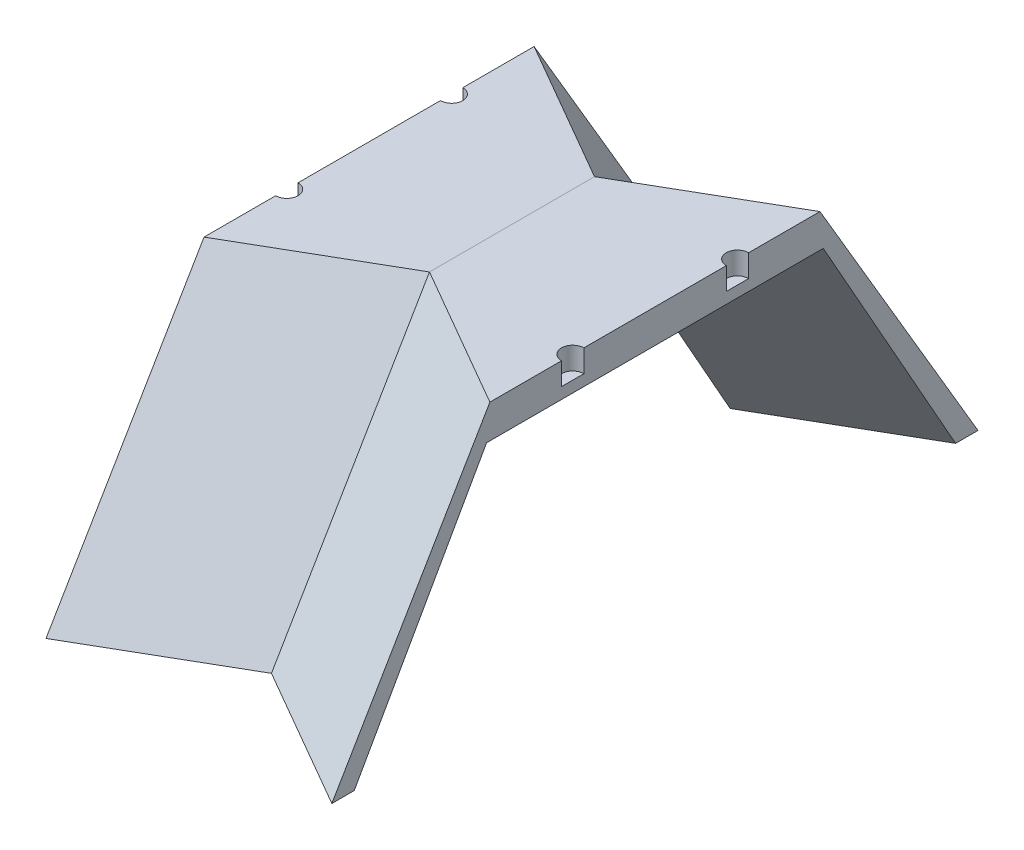
ISO-10303-21;
HEADER;
FILE_DESCRIPTION(('STEP AP214'),'2;1');
FILE_NAME('part.step','',(''),(''),'','','');
FILE_SCHEMA(('AUTOMOTIVE_DESIGN { 1 0 10303 214 1 1 1 1 }'));
ENDSEC;
DATA;
#1=APPLICATION_CONTEXT('core data for automotive mechanical design processes');
#2=APPLICATION_PROTOCOL_DEFINITION('international standard','automotive_design',2000,#1);
#3=PRODUCT_CONTEXT('',#1,'mechanical');
#4=PRODUCT('Part','Part','',(#3));
#5=PRODUCT_RELATED_PRODUCT_CATEGORY('part','',(#4));
#6=PRODUCT_DEFINITION_FORMATION('','',#4);
#7=PRODUCT_DEFINITION_CONTEXT('part definition',#1,'design');
#8=PRODUCT_DEFINITION('design','',#6,#7);
#9=PRODUCT_DEFINITION_SHAPE('','',#8);
#10=(LENGTH_UNIT() NAMED_UNIT(*) SI_UNIT(.MILLI.,.METRE.));
#11=(NAMED_UNIT(*) PLANE_ANGLE_UNIT() SI_UNIT($,.RADIAN.));
#12=(NAMED_UNIT(*) SI_UNIT($,.STERADIAN.) SOLID_ANGLE_UNIT());
#13=UNCERTAINTY_MEASURE_WITH_UNIT(LENGTH_MEASURE(1.E-05),#10,'distance_accuracy_value','');
#14=(GEOMETRIC_REPRESENTATION_CONTEXT(3) GLOBAL_UNCERTAINTY_ASSIGNED_CONTEXT((#13)) GLOBAL_UNIT_ASSIGNED_CONTEXT((#10,
#11,#12)) REPRESENTATION_CONTEXT('',''));
#15=CARTESIAN_POINT('',(0.,0.,0.));
#16=DIRECTION('',(0.,0.,1.));
#17=DIRECTION('',(1.,0.,0.));
#18=AXIS2_PLACEMENT_3D('',#15,#16,#17);
#19=CARTESIAN_POINT('',(-127.713892121337,0.,0.));
#20=DIRECTION('',(0.,1.,0.));
#21=DIRECTION('',(0.,0.,1.));
#22=AXIS2_PLACEMENT_3D('',#19,#20,#21);
#23=PLANE('',#22);
#24=DIRECTION('',(-0.866025403784439,0.,0.5));
#25=VECTOR('',#24,1.);
#26=CARTESIAN_POINT('',(-2.71389212133705,0.,72.1687836487032));
#27=LINE('',#26,#25);
#28=CARTESIAN_POINT('',(-63.8569460606685,0.,107.469742299652));
#29=VERTEX_POINT('',#28);
#30=CARTESIAN_POINT('',(-127.713892121337,0.,144.337567297407));
#31=VERTEX_POINT('',#30);
#32=EDGE_CURVE('E158',#29,#31,#27,.T.);
#33=ORIENTED_EDGE('',*,*,#32,.T.);
#34=DIRECTION('',(0.,0.,-1.));
#35=VECTOR('',#34,1.);
#36=CARTESIAN_POINT('',(-127.713892121337,0.,0.));
#37=LINE('',#36,#35);
#38=CARTESIAN_POINT('',(-127.713892121337,0.,134.337567297406));
#39=VERTEX_POINT('',#38);
#40=EDGE_CURVE('E229',#31,#39,#37,.T.);
#41=ORIENTED_EDGE('',*,*,#40,.T.);
#42=DIRECTION('',(0.866025403784439,0.,-0.5));
#43=VECTOR('',#42,1.);
#44=CARTESIAN_POINT('',(-127.713892121337,0.,134.337567297406));
#45=LINE('',#44,#43);
#46=CARTESIAN_POINT('',(-63.8569460606685,0.,97.469742299652));
#47=VERTEX_POINT('',#46);
#48=EDGE_CURVE('E159',#39,#47,#45,.T.);
#49=ORIENTED_EDGE('',*,*,#48,.T.);
#50=DIRECTION('',(0.,0.,-1.));
#51=VECTOR('',#50,1.);
#52=CARTESIAN_POINT('',(-63.8569460606685,0.,112.38082286301));
#53=LINE('',#52,#51);
#54=EDGE_CURVE('E144',#29,#47,#53,.T.);
#55=ORIENTED_EDGE('',*,*,#54,.F.);
#56=EDGE_LOOP('',(#33,#41,#49,#55));
#57=FACE_BOUND('',#56,.T.);
#58=ADVANCED_FACE('F54',(#57),#23,.F.);
#59=DIRECTION('',(-0.866025403784439,0.,-0.5));
#60=VECTOR('',#59,1.);
#61=CARTESIAN_POINT('',(-11.3741461591814,0.,-67.1687836487033));
#62=LINE('',#61,#60);
#63=CARTESIAN_POINT('',(-63.8569460606685,0.,-97.4697422996521));
#64=VERTEX_POINT('',#63);
#65=CARTESIAN_POINT('',(-127.713892121337,0.,-134.337567297406));
#66=VERTEX_POINT('',#65);
#67=EDGE_CURVE('E188',#64,#66,#62,.T.);
#68=ORIENTED_EDGE('',*,*,#67,.T.);
#69=CARTESIAN_POINT('',(-127.713892121337,0.,-144.337567297406));
#70=VERTEX_POINT('',#69);
#71=EDGE_CURVE('E223',#66,#70,#37,.T.);
#72=ORIENTED_EDGE('',*,*,#71,.T.);
#73=DIRECTION('',(0.866025403784439,0.,0.5));
#74=VECTOR('',#73,1.);
#75=CARTESIAN_POINT('',(-127.713892121337,0.,-144.337567297406));
#76=LINE('',#75,#74);
#77=CARTESIAN_POINT('',(-63.8569460606685,0.,-107.469742299652));
#78=VERTEX_POINT('',#77);
#79=EDGE_CURVE('E166',#70,#78,#76,.T.);
#80=ORIENTED_EDGE('',*,*,#79,.T.);
#81=EDGE_CURVE('E161',#64,#78,#53,.T.);
#82=ORIENTED_EDGE('',*,*,#81,.F.);
#83=EDGE_LOOP('',(#68,#72,#80,#82));
#84=FACE_BOUND('',#83,.T.);
#85=ADVANCED_FACE('F251',(#84),#23,.F.);
#86=CARTESIAN_POINT('',(-127.713892121337,120.,0.));
#87=DIRECTION('',(0.,1.,0.));
#88=DIRECTION('',(0.,0.,1.));
#89=AXIS2_PLACEMENT_3D('',#86,#87,#88);
#90=PLANE('',#89);
#91=DIRECTION('',(0.866025403784439,0.,-0.5));
#92=VECTOR('',#91,1.);
#93=CARTESIAN_POINT('',(-33.2854190910028,120.,19.21734567228));
#94=LINE('',#93,#92);
#95=CARTESIAN_POINT('',(-63.8569460606685,120.,36.8678249977544));
#96=VERTEX_POINT('',#95);
#97=CARTESIAN_POINT('',(-127.713892121337,120.,73.7356499955088));
#98=VERTEX_POINT('',#97);
#99=EDGE_CURVE('E205',#96,#98,#94,.F.);
#100=ORIENTED_EDGE('',*,*,#99,.F.);
#101=DIRECTION('',(0.,0.,-1.));
#102=VECTOR('',#101,1.);
#103=CARTESIAN_POINT('',(-63.8569460606685,120.,-72.1687836487033));
#104=LINE('',#103,#102);
#105=CARTESIAN_POINT('',(-63.8569460606685,120.,-36.8678249977544));
#106=VERTEX_POINT('',#105);
#107=EDGE_CURVE('E147',#106,#96,#104,.F.);
#108=ORIENTED_EDGE('',*,*,#107,.F.);
#109=DIRECTION('',(-0.866025403784439,0.,-0.5));
#110=VECTOR('',#109,1.);
#111=CARTESIAN_POINT('',(-158.285419091003,120.,-91.3861293209832));
#112=LINE('',#111,#110);
#113=CARTESIAN_POINT('',(-127.713892121337,120.,-73.7356499955088));
#114=VERTEX_POINT('',#113);
#115=EDGE_CURVE('E171',#114,#106,#112,.F.);
#116=ORIENTED_EDGE('',*,*,#115,.F.);
#117=DIRECTION('',(0.,0.,-1.));
#118=VECTOR('',#117,1.);
#119=CARTESIAN_POINT('',(-127.713892121337,120.,0.));
#120=LINE('',#119,#118);
#121=CARTESIAN_POINT('',(-127.713892121337,120.,-41.8678249977544));
#122=VERTEX_POINT('',#121);
#123=EDGE_CURVE('E227',#122,#114,#120,.T.);
#124=ORIENTED_EDGE('',*,*,#123,.F.);
#125=CARTESIAN_POINT('',(-127.713892121337,120.,-36.8678249977544));
#126=DIRECTION('',(0.,-1.,0.));
#127=DIRECTION('',(0.,0.,1.));
#128=AXIS2_PLACEMENT_3D('',#125,#126,#127);
#129=CIRCLE('',#128,5.);
#130=CARTESIAN_POINT('',(-127.713892121337,120.,-31.8678249977544));
#131=VERTEX_POINT('',#130);
#132=EDGE_CURVE('E199',#122,#131,#129,.T.);
#133=ORIENTED_EDGE('',*,*,#132,.T.);
#134=CARTESIAN_POINT('',(-127.713892121337,120.,31.7314973865064));
#135=VERTEX_POINT('',#134);
#136=EDGE_CURVE('E226',#135,#131,#120,.T.);
#137=ORIENTED_EDGE('',*,*,#136,.F.);
#138=CARTESIAN_POINT('',(-127.713892121337,120.,36.7314973865064));
#139=DIRECTION('',(0.,-1.,0.));
#140=DIRECTION('',(0.,0.,1.));
#141=AXIS2_PLACEMENT_3D('',#138,#139,#140);
#142=CIRCLE('',#141,5.);
#143=CARTESIAN_POINT('',(-127.713892121337,120.,41.7314973865064));
#144=VERTEX_POINT('',#143);
#145=EDGE_CURVE('E198',#135,#144,#142,.T.);
#146=ORIENTED_EDGE('',*,*,#145,.T.);
#147=EDGE_CURVE('E219',#98,#144,#120,.T.);
#148=ORIENTED_EDGE('',*,*,#147,.F.);
#149=EDGE_LOOP('',(#100,#108,#116,#124,#133,#137,#146,#148));
#150=FACE_BOUND('',#149,.T.);
#151=ADVANCED_FACE('F216',(#150),#90,.T.);
#152=CARTESIAN_POINT('',(-127.713892121337,110.,36.7314973865064));
#153=DIRECTION('',(0.,1.,0.));
#154=DIRECTION('',(0.,0.,1.));
#155=AXIS2_PLACEMENT_3D('',#152,#153,#154);
#156=CYLINDRICAL_SURFACE('',#155,5.);
#157=DIRECTION('',(0.,1.,0.));
#158=VECTOR('',#157,1.);
#159=CARTESIAN_POINT('',(-127.713892121337,110.,31.7314973865064));
#160=LINE('',#159,#158);
#161=CARTESIAN_POINT('',(-127.713892121337,110.,31.7314973865064));
#162=VERTEX_POINT('',#161);
#163=EDGE_CURVE('E236',#135,#162,#160,.F.);
#164=ORIENTED_EDGE('',*,*,#163,.T.);
#165=CARTESIAN_POINT('',(-127.713892121337,110.,36.7314973865064));
#166=DIRECTION('',(0.,-1.,0.));
#167=DIRECTION('',(0.,0.,1.));
#168=AXIS2_PLACEMENT_3D('',#165,#166,#167);
#169=CIRCLE('',#168,5.);
#170=CARTESIAN_POINT('',(-127.713892121337,110.,41.7314973865064));
#171=VERTEX_POINT('',#170);
#172=EDGE_CURVE('E202',#162,#171,#169,.T.);
#173=ORIENTED_EDGE('',*,*,#172,.T.);
#174=DIRECTION('',(0.,1.,0.));
#175=VECTOR('',#174,1.);
#176=CARTESIAN_POINT('',(-127.713892121337,110.,41.7314973865064));
#177=LINE('',#176,#175);
#178=EDGE_CURVE('E224',#171,#144,#177,.T.);
#179=ORIENTED_EDGE('',*,*,#178,.T.);
#180=ORIENTED_EDGE('',*,*,#145,.F.);
#181=EDGE_LOOP('',(#164,#173,#179,#180));
#182=FACE_BOUND('',#181,.T.);
#183=ADVANCED_FACE('F259',(#182),#156,.F.);
#184=CARTESIAN_POINT('',(-127.713892121337,110.,36.7314973865064));
#185=DIRECTION('',(0.,1.,0.));
#186=DIRECTION('',(0.,0.,1.));
#187=AXIS2_PLACEMENT_3D('',#184,#185,#186);
#188=PLANE('',#187);
#189=ORIENTED_EDGE('',*,*,#172,.F.);
#190=DIRECTION('',(0.,0.,-1.));
#191=VECTOR('',#190,1.);
#192=CARTESIAN_POINT('',(-127.713892121337,110.,36.7314973865064));
#193=LINE('',#192,#191);
#194=EDGE_CURVE('E231',#171,#162,#193,.T.);
#195=ORIENTED_EDGE('',*,*,#194,.F.);
#196=EDGE_LOOP('',(#189,#195));
#197=FACE_BOUND('',#196,.T.);
#198=ADVANCED_FACE('F263',(#197),#188,.T.);
#199=CARTESIAN_POINT('',(-127.713892121337,110.,-36.8678249977544));
#200=DIRECTION('',(0.,1.,0.));
#201=DIRECTION('',(0.,0.,1.));
#202=AXIS2_PLACEMENT_3D('',#199,#200,#201);
#203=CYLINDRICAL_SURFACE('',#202,5.);
#204=DIRECTION('',(0.,1.,0.));
#205=VECTOR('',#204,1.);
#206=CARTESIAN_POINT('',(-127.713892121337,110.,-41.8678249977544));
#207=LINE('',#206,#205);
#208=CARTESIAN_POINT('',(-127.713892121337,110.,-41.8678249977544));
#209=VERTEX_POINT('',#208);
#210=EDGE_CURVE('E237',#122,#209,#207,.F.);
#211=ORIENTED_EDGE('',*,*,#210,.T.);
#212=CARTESIAN_POINT('',(-127.713892121337,110.,-36.8678249977544));
#213=DIRECTION('',(0.,-1.,0.));
#214=DIRECTION('',(0.,0.,1.));
#215=AXIS2_PLACEMENT_3D('',#212,#213,#214);
#216=CIRCLE('',#215,5.);
#217=CARTESIAN_POINT('',(-127.713892121337,110.,-31.8678249977544));
#218=VERTEX_POINT('',#217);
#219=EDGE_CURVE('E195',#209,#218,#216,.T.);
#220=ORIENTED_EDGE('',*,*,#219,.T.);
#221=DIRECTION('',(0.,1.,0.));
#222=VECTOR('',#221,1.);
#223=CARTESIAN_POINT('',(-127.713892121337,110.,-31.8678249977544));
#224=LINE('',#223,#222);
#225=EDGE_CURVE('E239',#218,#131,#224,.T.);
#226=ORIENTED_EDGE('',*,*,#225,.T.);
#227=ORIENTED_EDGE('',*,*,#132,.F.);
#228=EDGE_LOOP('',(#211,#220,#226,#227));
#229=FACE_BOUND('',#228,.T.);
#230=ADVANCED_FACE('F265',(#229),#203,.F.);
#231=CARTESIAN_POINT('',(-127.713892121337,110.,-36.8678249977544));
#232=DIRECTION('',(0.,1.,0.));
#233=DIRECTION('',(0.,0.,1.));
#234=AXIS2_PLACEMENT_3D('',#231,#232,#233);
#235=PLANE('',#234);
#236=ORIENTED_EDGE('',*,*,#219,.F.);
#237=DIRECTION('',(0.,0.,-1.));
#238=VECTOR('',#237,1.);
#239=CARTESIAN_POINT('',(-127.713892121337,110.,-36.8678249977544));
#240=LINE('',#239,#238);
#241=EDGE_CURVE('E242',#218,#209,#240,.T.);
#242=ORIENTED_EDGE('',*,*,#241,.F.);
#243=EDGE_LOOP('',(#236,#242));
#244=FACE_BOUND('',#243,.T.);
#245=ADVANCED_FACE('F271',(#244),#235,.T.);
#246=CARTESIAN_POINT('',(-127.713892121337,105.,0.));
#247=DIRECTION('',(0.,-1.,0.));
#248=DIRECTION('',(0.,0.,-1.));
#249=AXIS2_PLACEMENT_3D('',#246,#247,#248);
#250=PLANE('',#249);
#251=DIRECTION('',(0.,0.,1.));
#252=VECTOR('',#251,1.);
#253=CARTESIAN_POINT('',(-63.8569460606685,105.,0.));
#254=LINE('',#253,#252);
#255=CARTESIAN_POINT('',(-63.8569460606685,105.,-38.3353086264309));
#256=VERTEX_POINT('',#255);
#257=CARTESIAN_POINT('',(-63.8569460606685,105.,38.3353086264309));
#258=VERTEX_POINT('',#257);
#259=EDGE_CURVE('E160',#256,#258,#254,.T.);
#260=ORIENTED_EDGE('',*,*,#259,.T.);
#261=DIRECTION('',(0.866025403784439,0.,-0.5));
#262=VECTOR('',#261,1.);
#263=CARTESIAN_POINT('',(-95.149980039967,105.,56.4023502181389));
#264=LINE('',#263,#262);
#265=CARTESIAN_POINT('',(-127.713892121337,105.,75.2031336241853));
#266=VERTEX_POINT('',#265);
#267=EDGE_CURVE('E185',#266,#258,#264,.T.);
#268=ORIENTED_EDGE('',*,*,#267,.F.);
#269=DIRECTION('',(0.,0.,1.));
#270=VECTOR('',#269,1.);
#271=CARTESIAN_POINT('',(-127.713892121337,105.,0.));
#272=LINE('',#271,#270);
#273=CARTESIAN_POINT('',(-127.713892121337,105.,-75.2031336241853));
#274=VERTEX_POINT('',#273);
#275=EDGE_CURVE('E62',#274,#266,#272,.T.);
#276=ORIENTED_EDGE('',*,*,#275,.F.);
#277=DIRECTION('',(-0.866025403784439,0.,-0.5));
#278=VECTOR('',#277,1.);
#279=CARTESIAN_POINT('',(-95.149980039967,105.,-56.402350218139));
#280=LINE('',#279,#278);
#281=EDGE_CURVE('E187',#256,#274,#280,.T.);
#282=ORIENTED_EDGE('',*,*,#281,.F.);
#283=EDGE_LOOP('',(#260,#268,#276,#282));
#284=FACE_BOUND('',#283,.T.);
#285=ADVANCED_FACE('F186',(#284),#250,.T.);
#286=CARTESIAN_POINT('',(-127.713892121337,0.,-144.337567297406));
#287=DIRECTION('',(0.445503262094184,0.453990499739547,-0.7716342848848));
#288=DIRECTION('',(0.,0.861891266296485,0.507093132552436));
#289=AXIS2_PLACEMENT_3D('',#286,#287,#288);
#290=PLANE('',#289);
#291=ORIENTED_EDGE('',*,*,#79,.F.);
#292=DIRECTION('',(0.,-0.861891266296485,-0.507093132552436));
#293=VECTOR('',#292,1.);
#294=CARTESIAN_POINT('',(-127.713892121337,0.,-144.337567297406));
#295=LINE('',#294,#293);
#296=EDGE_CURVE('E168',#114,#70,#295,.T.);
#297=ORIENTED_EDGE('',*,*,#296,.F.);
#298=ORIENTED_EDGE('',*,*,#115,.T.);
#299=DIRECTION('',(0.,-0.861891266296485,-0.507093132552436));
#300=VECTOR('',#299,1.);
#301=CARTESIAN_POINT('',(-63.8569460606685,-16.1134199663026,-116.950061832249));
#302=LINE('',#301,#300);
#303=EDGE_CURVE('E152',#78,#106,#302,.F.);
#304=ORIENTED_EDGE('',*,*,#303,.F.);
#305=EDGE_LOOP('',(#291,#297,#298,#304));
#306=FACE_BOUND('',#305,.T.);
#307=ADVANCED_FACE('F56',(#306),#290,.T.);
#308=CARTESIAN_POINT('',(-2.71389212133705,0.,72.1687836487032));
#309=DIRECTION('',(0.445503262094184,0.453990499739547,0.7716342848848));
#310=DIRECTION('',(0.,-0.861891266296485,0.507093132552436));
#311=AXIS2_PLACEMENT_3D('',#308,#309,#310);
#312=PLANE('',#311);
#313=ORIENTED_EDGE('',*,*,#99,.T.);
#314=DIRECTION('',(0.,-0.861891266296485,0.507093132552436));
#315=VECTOR('',#314,1.);
#316=CARTESIAN_POINT('',(-127.713892121337,0.,144.337567297406));
#317=LINE('',#316,#315);
#318=EDGE_CURVE('E164',#98,#31,#317,.T.);
#319=ORIENTED_EDGE('',*,*,#318,.T.);
#320=ORIENTED_EDGE('',*,*,#32,.F.);
#321=DIRECTION('',(0.,0.861891266296485,-0.507093132552436));
#322=VECTOR('',#321,1.);
#323=CARTESIAN_POINT('',(-63.8569460606685,15.4286067049105,98.3923321774554));
#324=LINE('',#323,#322);
#325=EDGE_CURVE('E140',#96,#29,#324,.F.);
#326=ORIENTED_EDGE('',*,*,#325,.F.);
#327=EDGE_LOOP('',(#313,#319,#320,#326));
#328=FACE_BOUND('',#327,.T.);
#329=ADVANCED_FACE('F163',(#328),#312,.T.);
#330=CARTESIAN_POINT('',(-11.3741461591814,0.,-67.1687836487033));
#331=DIRECTION('',(0.449397023149583,0.438371146789078,-0.778378476865285));
#332=DIRECTION('',(0.866025403784439,0.,0.5));
#333=AXIS2_PLACEMENT_3D('',#330,#331,#332);
#334=PLANE('',#333);
#335=ORIENTED_EDGE('',*,*,#281,.T.);
#336=DIRECTION('',(0.,-0.871320352686952,-0.490714624800898));
#337=VECTOR('',#336,1.);
#338=CARTESIAN_POINT('',(-127.713892121337,28.7193326405665,-118.163267571952));
#339=LINE('',#338,#337);
#340=EDGE_CURVE('E180',#274,#66,#339,.T.);
#341=ORIENTED_EDGE('',*,*,#340,.T.);
#342=ORIENTED_EDGE('',*,*,#67,.F.);
#343=DIRECTION('',(0.,-0.871320352686952,-0.490714624800898));
#344=VECTOR('',#343,1.);
#345=CARTESIAN_POINT('',(-63.8569460606685,12.955769980531,-90.1732459129929));
#346=LINE('',#345,#344);
#347=EDGE_CURVE('E153',#256,#64,#346,.T.);
#348=ORIENTED_EDGE('',*,*,#347,.F.);
#349=EDGE_LOOP('',(#335,#341,#342,#348));
#350=FACE_BOUND('',#349,.T.);
#351=ADVANCED_FACE('F253',(#350),#334,.F.);
#352=CARTESIAN_POINT('',(-127.713892121337,0.,134.337567297406));
#353=DIRECTION('',(0.449397023149583,0.438371146789078,0.778378476865285));
#354=DIRECTION('',(-0.866025403784439,0.,0.5));
#355=AXIS2_PLACEMENT_3D('',#352,#353,#354);
#356=PLANE('',#355);
#357=ORIENTED_EDGE('',*,*,#48,.F.);
#358=DIRECTION('',(0.,-0.871320352686952,0.490714624800897));
#359=VECTOR('',#358,1.);
#360=CARTESIAN_POINT('',(-127.713892121337,28.7193326405664,118.163267571952));
#361=LINE('',#360,#359);
#362=EDGE_CURVE('E74',#266,#39,#361,.T.);
#363=ORIENTED_EDGE('',*,*,#362,.F.);
#364=ORIENTED_EDGE('',*,*,#267,.T.);
#365=DIRECTION('',(0.,0.871320352686952,-0.490714624800898));
#366=VECTOR('',#365,1.);
#367=CARTESIAN_POINT('',(-63.8569460606685,-15.7635626600355,106.347545638448));
#368=LINE('',#367,#366);
#369=EDGE_CURVE('E14',#47,#258,#368,.T.);
#370=ORIENTED_EDGE('',*,*,#369,.F.);
#371=EDGE_LOOP('',(#357,#363,#364,#370));
#372=FACE_BOUND('',#371,.T.);
#373=ADVANCED_FACE('F285',(#372),#356,.F.);
#374=CARTESIAN_POINT('',(-127.713892121337,0.,0.));
#375=DIRECTION('',(-1.,0.,0.));
#376=DIRECTION('',(0.,0.,-1.));
#377=AXIS2_PLACEMENT_3D('',#374,#375,#376);
#378=PLANE('',#377);
#379=ORIENTED_EDGE('',*,*,#40,.F.);
#380=ORIENTED_EDGE('',*,*,#318,.F.);
#381=ORIENTED_EDGE('',*,*,#147,.T.);
#382=ORIENTED_EDGE('',*,*,#178,.F.);
#383=ORIENTED_EDGE('',*,*,#194,.T.);
#384=ORIENTED_EDGE('',*,*,#163,.F.);
#385=ORIENTED_EDGE('',*,*,#136,.T.);
#386=ORIENTED_EDGE('',*,*,#225,.F.);
#387=ORIENTED_EDGE('',*,*,#241,.T.);
#388=ORIENTED_EDGE('',*,*,#210,.F.);
#389=ORIENTED_EDGE('',*,*,#123,.T.);
#390=ORIENTED_EDGE('',*,*,#296,.T.);
#391=ORIENTED_EDGE('',*,*,#71,.F.);
#392=ORIENTED_EDGE('',*,*,#340,.F.);
#393=ORIENTED_EDGE('',*,*,#275,.T.);
#394=ORIENTED_EDGE('',*,*,#362,.T.);
#395=EDGE_LOOP('',(#379,#380,#381,#382,#383,#384,#385,#386,#387,#388,#389,#390,#391,#392,#393,#394));
#396=FACE_BOUND('',#395,.T.);
#397=ADVANCED_FACE('F178',(#396),#378,.T.);
#398=CARTESIAN_POINT('',(-63.8569460606685,0.,112.38082286301));
#399=DIRECTION('',(-1.,0.,0.));
#400=DIRECTION('',(0.,0.,-1.));
#401=AXIS2_PLACEMENT_3D('',#398,#399,#400);
#402=PLANE('',#401);
#403=ORIENTED_EDGE('',*,*,#81,.T.);
#404=ORIENTED_EDGE('',*,*,#303,.T.);
#405=ORIENTED_EDGE('',*,*,#107,.T.);
#406=ORIENTED_EDGE('',*,*,#325,.T.);
#407=ORIENTED_EDGE('',*,*,#54,.T.);
#408=ORIENTED_EDGE('',*,*,#369,.T.);
#409=ORIENTED_EDGE('',*,*,#259,.F.);
#410=ORIENTED_EDGE('',*,*,#347,.T.);
#411=EDGE_LOOP('',(#403,#404,#405,#406,#407,#408,#409,#410));
#412=FACE_BOUND('',#411,.T.);
#413=ADVANCED_FACE('F143',(#412),#402,.F.);
#414=CLOSED_SHELL('',(#58,#85,#151,#183,#198,#230,#245,#285,#307,#329,#351,#373,#397,#413));
#415=MANIFOLD_SOLID_BREP('B2',#414);
#416=CARTESIAN_POINT('',(0.,0.,0.));
#417=DIRECTION('',(0.,1.,0.));
#418=DIRECTION('',(0.,0.,1.));
#419=AXIS2_PLACEMENT_3D('',#416,#417,#418);
#420=PLANE('',#419);
#421=DIRECTION('',(0.866025403784439,0.,0.5));
#422=VECTOR('',#421,1.);
#423=CARTESIAN_POINT('',(-125.,0.,72.1687836487032));
#424=LINE('',#423,#422);
#425=CARTESIAN_POINT('',(-63.8569460606685,0.,107.469742299652));
#426=VERTEX_POINT('',#425);
#427=CARTESIAN_POINT('',(0.,0.,144.337567297407));
#428=VERTEX_POINT('',#427);
#429=EDGE_CURVE('E500',#426,#428,#424,.T.);
#430=ORIENTED_EDGE('',*,*,#429,.F.);
#431=DIRECTION('',(0.,0.,-1.));
#432=VECTOR('',#431,1.);
#433=CARTESIAN_POINT('',(-63.8569460606685,0.,112.38082286301));
#434=LINE('',#433,#432);
#435=CARTESIAN_POINT('',(-63.8569460606685,0.,97.469742299652));
#436=VERTEX_POINT('',#435);
#437=EDGE_CURVE('E485',#426,#436,#434,.T.);
#438=ORIENTED_EDGE('',*,*,#437,.T.);
#439=DIRECTION('',(-0.866025403784439,0.,-0.5));
#440=VECTOR('',#439,1.);
#441=CARTESIAN_POINT('',(0.,0.,134.337567297406));
#442=LINE('',#441,#440);
#443=CARTESIAN_POINT('',(0.,0.,134.337567297406));
#444=VERTEX_POINT('',#443);
#445=EDGE_CURVE('E534',#444,#436,#442,.T.);
#446=ORIENTED_EDGE('',*,*,#445,.F.);
#447=DIRECTION('',(0.,0.,-1.));
#448=VECTOR('',#447,1.);
#449=CARTESIAN_POINT('',(0.,0.,0.));
#450=LINE('',#449,#448);
#451=EDGE_CURVE('E508',#428,#444,#450,.T.);
#452=ORIENTED_EDGE('',*,*,#451,.F.);
#453=EDGE_LOOP('',(#430,#438,#446,#452));
#454=FACE_BOUND('',#453,.T.);
#455=ADVANCED_FACE('F398',(#454),#420,.F.);
#456=DIRECTION('',(0.866025403784439,0.,-0.5));
#457=VECTOR('',#456,1.);
#458=CARTESIAN_POINT('',(-116.339745962156,0.,-67.1687836487033));
#459=LINE('',#458,#457);
#460=CARTESIAN_POINT('',(-63.8569460606685,0.,-97.4697422996521));
#461=VERTEX_POINT('',#460);
#462=CARTESIAN_POINT('',(0.,0.,-134.337567297406));
#463=VERTEX_POINT('',#462);
#464=EDGE_CURVE('E531',#461,#463,#459,.T.);
#465=ORIENTED_EDGE('',*,*,#464,.F.);
#466=CARTESIAN_POINT('',(-63.8569460606685,0.,-107.469742299652));
#467=VERTEX_POINT('',#466);
#468=EDGE_CURVE('E494',#461,#467,#434,.T.);
#469=ORIENTED_EDGE('',*,*,#468,.T.);
#470=DIRECTION('',(-0.866025403784439,0.,0.5));
#471=VECTOR('',#470,1.);
#472=CARTESIAN_POINT('',(0.,0.,-144.337567297406));
#473=LINE('',#472,#471);
#474=CARTESIAN_POINT('',(0.,0.,-144.337567297406));
#475=VERTEX_POINT('',#474);
#476=EDGE_CURVE('E510',#475,#467,#473,.T.);
#477=ORIENTED_EDGE('',*,*,#476,.F.);
#478=EDGE_CURVE('E584',#463,#475,#450,.T.);
#479=ORIENTED_EDGE('',*,*,#478,.F.);
#480=EDGE_LOOP('',(#465,#469,#477,#479));
#481=FACE_BOUND('',#480,.T.);
#482=ADVANCED_FACE('F592',(#481),#420,.F.);
#483=CARTESIAN_POINT('',(0.,120.,0.));
#484=DIRECTION('',(0.,1.,0.));
#485=DIRECTION('',(0.,0.,1.));
#486=AXIS2_PLACEMENT_3D('',#483,#484,#485);
#487=PLANE('',#486);
#488=DIRECTION('',(-0.866025403784439,0.,-0.5));
#489=VECTOR('',#488,1.);
#490=CARTESIAN_POINT('',(-94.4284730303342,120.,19.21734567228));
#491=LINE('',#490,#489);
#492=CARTESIAN_POINT('',(-63.8569460606685,120.,36.8678249977544));
#493=VERTEX_POINT('',#492);
#494=CARTESIAN_POINT('',(0.,120.,73.7356499955088));
#495=VERTEX_POINT('',#494);
#496=EDGE_CURVE('E503',#493,#495,#491,.F.);
#497=ORIENTED_EDGE('',*,*,#496,.T.);
#498=DIRECTION('',(0.,0.,-1.));
#499=VECTOR('',#498,1.);
#500=CARTESIAN_POINT('',(0.,120.,0.));
#501=LINE('',#500,#499);
#502=CARTESIAN_POINT('',(0.,120.,41.7314973865064));
#503=VERTEX_POINT('',#502);
#504=EDGE_CURVE('E576',#495,#503,#501,.T.);
#505=ORIENTED_EDGE('',*,*,#504,.T.);
#506=CARTESIAN_POINT('',(0.,120.,36.7314973865064));
#507=DIRECTION('',(0.,1.,0.));
#508=DIRECTION('',(0.,0.,1.));
#509=AXIS2_PLACEMENT_3D('',#506,#507,#508);
#510=CIRCLE('',#509,5.);
#511=CARTESIAN_POINT('',(0.,120.,31.7314973865064));
#512=VERTEX_POINT('',#511);
#513=EDGE_CURVE('E541',#512,#503,#510,.T.);
#514=ORIENTED_EDGE('',*,*,#513,.F.);
#515=CARTESIAN_POINT('',(0.,120.,-31.8678249977544));
#516=VERTEX_POINT('',#515);
#517=EDGE_CURVE('E575',#512,#516,#501,.T.);
#518=ORIENTED_EDGE('',*,*,#517,.T.);
#519=CARTESIAN_POINT('',(0.,120.,-36.8678249977544));
#520=DIRECTION('',(0.,1.,0.));
#521=DIRECTION('',(0.,0.,1.));
#522=AXIS2_PLACEMENT_3D('',#519,#520,#521);
#523=CIRCLE('',#522,5.);
#524=CARTESIAN_POINT('',(0.,120.,-41.8678249977544));
#525=VERTEX_POINT('',#524);
#526=EDGE_CURVE('E542',#525,#516,#523,.T.);
#527=ORIENTED_EDGE('',*,*,#526,.F.);
#528=CARTESIAN_POINT('',(0.,120.,-73.7356499955088));
#529=VERTEX_POINT('',#528);
#530=EDGE_CURVE('E559',#525,#529,#501,.T.);
#531=ORIENTED_EDGE('',*,*,#530,.T.);
#532=DIRECTION('',(0.866025403784439,0.,-0.5));
#533=VECTOR('',#532,1.);
#534=CARTESIAN_POINT('',(30.5715269696658,120.,-91.3861293209832));
#535=LINE('',#534,#533);
#536=CARTESIAN_POINT('',(-63.8569460606685,120.,-36.8678249977544));
#537=VERTEX_POINT('',#536);
#538=EDGE_CURVE('E515',#529,#537,#535,.F.);
#539=ORIENTED_EDGE('',*,*,#538,.T.);
#540=DIRECTION('',(0.,0.,-1.));
#541=VECTOR('',#540,1.);
#542=CARTESIAN_POINT('',(-63.8569460606685,120.,-72.1687836487033));
#543=LINE('',#542,#541);
#544=EDGE_CURVE('E552',#537,#493,#543,.F.);
#545=ORIENTED_EDGE('',*,*,#544,.T.);
#546=EDGE_LOOP('',(#497,#505,#514,#518,#527,#531,#539,#545));
#547=FACE_BOUND('',#546,.T.);
#548=ADVANCED_FACE('F557',(#547),#487,.T.);
#549=CARTESIAN_POINT('',(0.,110.,36.7314973865064));
#550=DIRECTION('',(0.,1.,0.));
#551=DIRECTION('',(0.,0.,1.));
#552=AXIS2_PLACEMENT_3D('',#549,#550,#551);
#553=CYLINDRICAL_SURFACE('',#552,5.);
#554=DIRECTION('',(0.,1.,0.));
#555=VECTOR('',#554,1.);
#556=CARTESIAN_POINT('',(0.,110.,31.7314973865064));
#557=LINE('',#556,#555);
#558=CARTESIAN_POINT('',(0.,110.,31.7314973865064));
#559=VERTEX_POINT('',#558);
#560=EDGE_CURVE('E577',#512,#559,#557,.F.);
#561=ORIENTED_EDGE('',*,*,#560,.F.);
#562=ORIENTED_EDGE('',*,*,#513,.T.);
#563=DIRECTION('',(0.,1.,0.));
#564=VECTOR('',#563,1.);
#565=CARTESIAN_POINT('',(0.,110.,41.7314973865064));
#566=LINE('',#565,#564);
#567=CARTESIAN_POINT('',(0.,110.,41.7314973865064));
#568=VERTEX_POINT('',#567);
#569=EDGE_CURVE('E582',#568,#503,#566,.T.);
#570=ORIENTED_EDGE('',*,*,#569,.F.);
#571=CARTESIAN_POINT('',(0.,110.,36.7314973865064));
#572=DIRECTION('',(0.,1.,0.));
#573=DIRECTION('',(0.,0.,1.));
#574=AXIS2_PLACEMENT_3D('',#571,#572,#573);
#575=CIRCLE('',#574,5.);
#576=EDGE_CURVE('E546',#559,#568,#575,.T.);
#577=ORIENTED_EDGE('',*,*,#576,.F.);
#578=EDGE_LOOP('',(#561,#562,#570,#577));
#579=FACE_BOUND('',#578,.T.);
#580=ADVANCED_FACE('F612',(#579),#553,.F.);
#581=CARTESIAN_POINT('',(0.,110.,36.7314973865064));
#582=DIRECTION('',(0.,1.,0.));
#583=DIRECTION('',(0.,0.,1.));
#584=AXIS2_PLACEMENT_3D('',#581,#582,#583);
#585=PLANE('',#584);
#586=ORIENTED_EDGE('',*,*,#576,.T.);
#587=DIRECTION('',(0.,0.,-1.));
#588=VECTOR('',#587,1.);
#589=CARTESIAN_POINT('',(0.,110.,36.7314973865064));
#590=LINE('',#589,#588);
#591=EDGE_CURVE('E579',#568,#559,#590,.T.);
#592=ORIENTED_EDGE('',*,*,#591,.T.);
#593=EDGE_LOOP('',(#586,#592));
#594=FACE_BOUND('',#593,.T.);
#595=ADVANCED_FACE('F615',(#594),#585,.T.);
#596=CARTESIAN_POINT('',(0.,110.,-36.8678249977544));
#597=DIRECTION('',(0.,1.,0.));
#598=DIRECTION('',(0.,0.,1.));
#599=AXIS2_PLACEMENT_3D('',#596,#597,#598);
#600=CYLINDRICAL_SURFACE('',#599,5.);
#601=DIRECTION('',(0.,1.,0.));
#602=VECTOR('',#601,1.);
#603=CARTESIAN_POINT('',(0.,110.,-41.8678249977544));
#604=LINE('',#603,#602);
#605=CARTESIAN_POINT('',(0.,110.,-41.8678249977544));
#606=VERTEX_POINT('',#605);
#607=EDGE_CURVE('E572',#525,#606,#604,.F.);
#608=ORIENTED_EDGE('',*,*,#607,.F.);
#609=ORIENTED_EDGE('',*,*,#526,.T.);
#610=DIRECTION('',(0.,1.,0.));
#611=VECTOR('',#610,1.);
#612=CARTESIAN_POINT('',(0.,110.,-31.8678249977544));
#613=LINE('',#612,#611);
#614=CARTESIAN_POINT('',(0.,110.,-31.8678249977544));
#615=VERTEX_POINT('',#614);
#616=EDGE_CURVE('E567',#615,#516,#613,.T.);
#617=ORIENTED_EDGE('',*,*,#616,.F.);
#618=CARTESIAN_POINT('',(0.,110.,-36.8678249977544));
#619=DIRECTION('',(0.,1.,0.));
#620=DIRECTION('',(0.,0.,1.));
#621=AXIS2_PLACEMENT_3D('',#618,#619,#620);
#622=CIRCLE('',#621,5.);
#623=EDGE_CURVE('E538',#606,#615,#622,.T.);
#624=ORIENTED_EDGE('',*,*,#623,.F.);
#625=EDGE_LOOP('',(#608,#609,#617,#624));
#626=FACE_BOUND('',#625,.T.);
#627=ADVANCED_FACE('F619',(#626),#600,.F.);
#628=CARTESIAN_POINT('',(0.,110.,-36.8678249977544));
#629=DIRECTION('',(0.,1.,0.));
#630=DIRECTION('',(0.,0.,1.));
#631=AXIS2_PLACEMENT_3D('',#628,#629,#630);
#632=PLANE('',#631);
#633=ORIENTED_EDGE('',*,*,#623,.T.);
#634=DIRECTION('',(0.,0.,-1.));
#635=VECTOR('',#634,1.);
#636=CARTESIAN_POINT('',(0.,110.,-36.8678249977544));
#637=LINE('',#636,#635);
#638=EDGE_CURVE('E564',#615,#606,#637,.T.);
#639=ORIENTED_EDGE('',*,*,#638,.T.);
#640=EDGE_LOOP('',(#633,#639));
#641=FACE_BOUND('',#640,.T.);
#642=ADVANCED_FACE('F622',(#641),#632,.T.);
#643=CARTESIAN_POINT('',(0.,105.,0.));
#644=DIRECTION('',(0.,-1.,0.));
#645=DIRECTION('',(0.,0.,-1.));
#646=AXIS2_PLACEMENT_3D('',#643,#644,#645);
#647=PLANE('',#646);
#648=DIRECTION('',(0.,0.,1.));
#649=VECTOR('',#648,1.);
#650=CARTESIAN_POINT('',(-63.8569460606685,105.,0.));
#651=LINE('',#650,#649);
#652=CARTESIAN_POINT('',(-63.8569460606685,105.,-38.3353086264309));
#653=VERTEX_POINT('',#652);
#654=CARTESIAN_POINT('',(-63.8569460606685,105.,38.3353086264309));
#655=VERTEX_POINT('',#654);
#656=EDGE_CURVE('E413',#653,#655,#651,.T.);
#657=ORIENTED_EDGE('',*,*,#656,.F.);
#658=DIRECTION('',(0.866025403784439,0.,-0.5));
#659=VECTOR('',#658,1.);
#660=CARTESIAN_POINT('',(-32.5639120813701,105.,-56.402350218139));
#661=LINE('',#660,#659);
#662=CARTESIAN_POINT('',(0.,105.,-75.2031336241853));
#663=VERTEX_POINT('',#662);
#664=EDGE_CURVE('E526',#653,#663,#661,.T.);
#665=ORIENTED_EDGE('',*,*,#664,.T.);
#666=DIRECTION('',(0.,0.,1.));
#667=VECTOR('',#666,1.);
#668=CARTESIAN_POINT('',(0.,105.,0.));
#669=LINE('',#668,#667);
#670=CARTESIAN_POINT('',(0.,105.,75.2031336241853));
#671=VERTEX_POINT('',#670);
#672=EDGE_CURVE('E406',#663,#671,#669,.T.);
#673=ORIENTED_EDGE('',*,*,#672,.T.);
#674=DIRECTION('',(-0.866025403784439,0.,-0.5));
#675=VECTOR('',#674,1.);
#676=CARTESIAN_POINT('',(-32.56391208137,105.,56.4023502181389));
#677=LINE('',#676,#675);
#678=EDGE_CURVE('E524',#671,#655,#677,.T.);
#679=ORIENTED_EDGE('',*,*,#678,.T.);
#680=EDGE_LOOP('',(#657,#665,#673,#679));
#681=FACE_BOUND('',#680,.T.);
#682=ADVANCED_FACE('F523',(#681),#647,.T.);
#683=CARTESIAN_POINT('',(0.,0.,-144.337567297406));
#684=DIRECTION('',(-0.445503262094184,0.453990499739547,-0.7716342848848));
#685=DIRECTION('',(0.,0.861891266296485,0.507093132552436));
#686=AXIS2_PLACEMENT_3D('',#683,#684,#685);
#687=PLANE('',#686);
#688=ORIENTED_EDGE('',*,*,#476,.T.);
#689=DIRECTION('',(0.,-0.861891266296485,-0.507093132552436));
#690=VECTOR('',#689,1.);
#691=CARTESIAN_POINT('',(-63.8569460606685,-16.1134199663026,-116.950061832249));
#692=LINE('',#691,#690);
#693=EDGE_CURVE('E504',#467,#537,#692,.F.);
#694=ORIENTED_EDGE('',*,*,#693,.T.);
#695=ORIENTED_EDGE('',*,*,#538,.F.);
#696=DIRECTION('',(0.,-0.861891266296485,-0.507093132552436));
#697=VECTOR('',#696,1.);
#698=CARTESIAN_POINT('',(0.,0.,-144.337567297406));
#699=LINE('',#698,#697);
#700=EDGE_CURVE('E512',#529,#475,#699,.T.);
#701=ORIENTED_EDGE('',*,*,#700,.T.);
#702=EDGE_LOOP('',(#688,#694,#695,#701));
#703=FACE_BOUND('',#702,.T.);
#704=ADVANCED_FACE('F400',(#703),#687,.T.);
#705=CARTESIAN_POINT('',(-125.,0.,72.1687836487032));
#706=DIRECTION('',(-0.445503262094184,0.453990499739547,0.7716342848848));
#707=DIRECTION('',(0.,-0.861891266296485,0.507093132552436));
#708=AXIS2_PLACEMENT_3D('',#705,#706,#707);
#709=PLANE('',#708);
#710=ORIENTED_EDGE('',*,*,#496,.F.);
#711=DIRECTION('',(0.,0.861891266296485,-0.507093132552436));
#712=VECTOR('',#711,1.);
#713=CARTESIAN_POINT('',(-63.8569460606685,15.4286067049105,98.3923321774554));
#714=LINE('',#713,#712);
#715=EDGE_CURVE('E488',#493,#426,#714,.F.);
#716=ORIENTED_EDGE('',*,*,#715,.T.);
#717=ORIENTED_EDGE('',*,*,#429,.T.);
#718=DIRECTION('',(0.,-0.861891266296485,0.507093132552436));
#719=VECTOR('',#718,1.);
#720=CARTESIAN_POINT('',(0.,0.,144.337567297406));
#721=LINE('',#720,#719);
#722=EDGE_CURVE('E509',#495,#428,#721,.T.);
#723=ORIENTED_EDGE('',*,*,#722,.F.);
#724=EDGE_LOOP('',(#710,#716,#717,#723));
#725=FACE_BOUND('',#724,.T.);
#726=ADVANCED_FACE('F498',(#725),#709,.T.);
#727=CARTESIAN_POINT('',(-116.339745962156,0.,-67.1687836487033));
#728=DIRECTION('',(-0.449397023149583,0.438371146789078,-0.778378476865285));
#729=DIRECTION('',(-0.866025403784439,0.,0.5));
#730=AXIS2_PLACEMENT_3D('',#727,#728,#729);
#731=PLANE('',#730);
#732=ORIENTED_EDGE('',*,*,#664,.F.);
#733=DIRECTION('',(0.,-0.871320352686952,-0.490714624800898));
#734=VECTOR('',#733,1.);
#735=CARTESIAN_POINT('',(-63.8569460606685,12.955769980531,-90.1732459129929));
#736=LINE('',#735,#734);
#737=EDGE_CURVE('E505',#653,#461,#736,.T.);
#738=ORIENTED_EDGE('',*,*,#737,.T.);
#739=ORIENTED_EDGE('',*,*,#464,.T.);
#740=DIRECTION('',(0.,-0.871320352686952,-0.490714624800898));
#741=VECTOR('',#740,1.);
#742=CARTESIAN_POINT('',(0.,28.7193326405665,-118.163267571952));
#743=LINE('',#742,#741);
#744=EDGE_CURVE('E545',#663,#463,#743,.T.);
#745=ORIENTED_EDGE('',*,*,#744,.F.);
#746=EDGE_LOOP('',(#732,#738,#739,#745));
#747=FACE_BOUND('',#746,.T.);
#748=ADVANCED_FACE('F595',(#747),#731,.F.);
#749=CARTESIAN_POINT('',(0.,0.,134.337567297406));
#750=DIRECTION('',(-0.449397023149583,0.438371146789078,0.778378476865285));
#751=DIRECTION('',(0.866025403784439,0.,0.5));
#752=AXIS2_PLACEMENT_3D('',#749,#750,#751);
#753=PLANE('',#752);
#754=ORIENTED_EDGE('',*,*,#445,.T.);
#755=DIRECTION('',(0.,0.871320352686952,-0.490714624800898));
#756=VECTOR('',#755,1.);
#757=CARTESIAN_POINT('',(-63.8569460606685,-15.7635626600355,106.347545638448));
#758=LINE('',#757,#756);
#759=EDGE_CURVE('E52',#436,#655,#758,.T.);
#760=ORIENTED_EDGE('',*,*,#759,.T.);
#761=ORIENTED_EDGE('',*,*,#678,.F.);
#762=DIRECTION('',(0.,-0.871320352686952,0.490714624800897));
#763=VECTOR('',#762,1.);
#764=CARTESIAN_POINT('',(0.,28.7193326405664,118.163267571952));
#765=LINE('',#764,#763);
#766=EDGE_CURVE('E420',#671,#444,#765,.T.);
#767=ORIENTED_EDGE('',*,*,#766,.T.);
#768=EDGE_LOOP('',(#754,#760,#761,#767));
#769=FACE_BOUND('',#768,.T.);
#770=ADVANCED_FACE('F530',(#769),#753,.F.);
#771=CARTESIAN_POINT('',(0.,0.,0.));
#772=DIRECTION('',(1.,0.,0.));
#773=DIRECTION('',(0.,0.,-1.));
#774=AXIS2_PLACEMENT_3D('',#771,#772,#773);
#775=PLANE('',#774);
#776=ORIENTED_EDGE('',*,*,#451,.T.);
#777=ORIENTED_EDGE('',*,*,#766,.F.);
#778=ORIENTED_EDGE('',*,*,#672,.F.);
#779=ORIENTED_EDGE('',*,*,#744,.T.);
#780=ORIENTED_EDGE('',*,*,#478,.T.);
#781=ORIENTED_EDGE('',*,*,#700,.F.);
#782=ORIENTED_EDGE('',*,*,#530,.F.);
#783=ORIENTED_EDGE('',*,*,#607,.T.);
#784=ORIENTED_EDGE('',*,*,#638,.F.);
#785=ORIENTED_EDGE('',*,*,#616,.T.);
#786=ORIENTED_EDGE('',*,*,#517,.F.);
#787=ORIENTED_EDGE('',*,*,#560,.T.);
#788=ORIENTED_EDGE('',*,*,#591,.F.);
#789=ORIENTED_EDGE('',*,*,#569,.T.);
#790=ORIENTED_EDGE('',*,*,#504,.F.);
#791=ORIENTED_EDGE('',*,*,#722,.T.);
#792=EDGE_LOOP('',(#776,#777,#778,#779,#780,#781,#782,#783,#784,#785,#786,#787,#788,#789,#790,#791));
#793=FACE_BOUND('',#792,.T.);
#794=ADVANCED_FACE('F588',(#793),#775,.T.);
#795=CARTESIAN_POINT('',(-63.8569460606685,0.,112.38082286301));
#796=DIRECTION('',(1.,0.,0.));
#797=DIRECTION('',(0.,0.,-1.));
#798=AXIS2_PLACEMENT_3D('',#795,#796,#797);
#799=PLANE('',#798);
#800=ORIENTED_EDGE('',*,*,#468,.F.);
#801=ORIENTED_EDGE('',*,*,#737,.F.);
#802=ORIENTED_EDGE('',*,*,#656,.T.);
#803=ORIENTED_EDGE('',*,*,#759,.F.);
#804=ORIENTED_EDGE('',*,*,#437,.F.);
#805=ORIENTED_EDGE('',*,*,#715,.F.);
#806=ORIENTED_EDGE('',*,*,#544,.F.);
#807=ORIENTED_EDGE('',*,*,#693,.F.);
#808=EDGE_LOOP('',(#800,#801,#802,#803,#804,#805,#806,#807));
#809=FACE_BOUND('',#808,.T.);
#810=ADVANCED_FACE('F487',(#809),#799,.F.);
#811=CLOSED_SHELL('',(#455,#482,#548,#580,#595,#627,#642,#682,#704,#726,#748,#770,#794,#810));
#812=MANIFOLD_SOLID_BREP('B8',#811);
#813=ADVANCED_BREP_SHAPE_REPRESENTATION('',(#18,#415,#812),#14);
#814=SHAPE_DEFINITION_REPRESENTATION(#9,#813);
ENDSEC;
END-ISO-10303-21;
